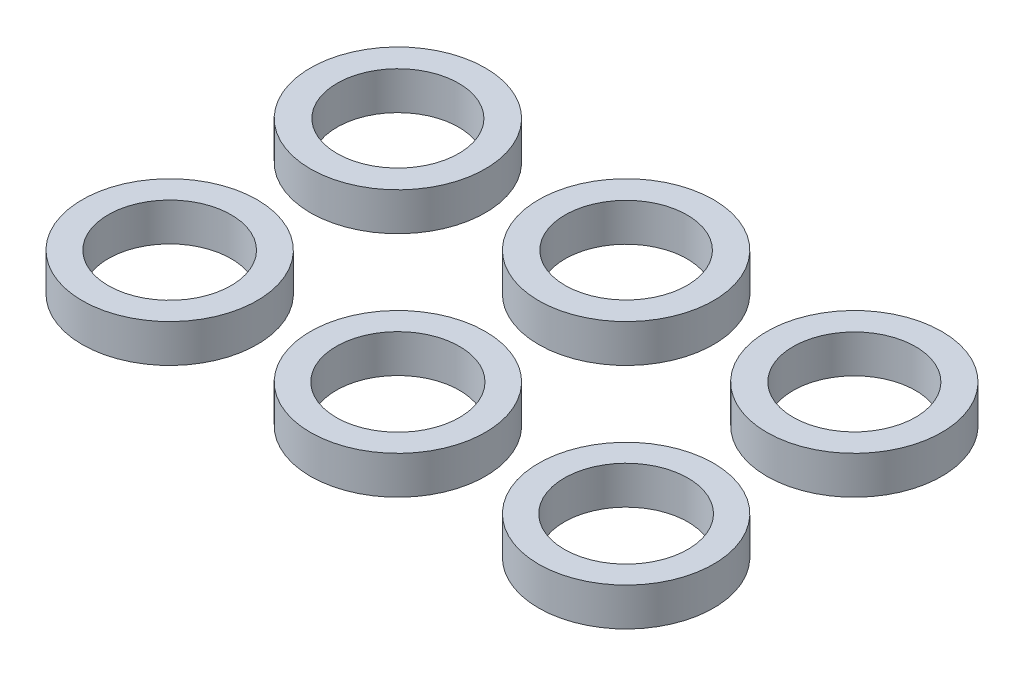
ISO-10303-21;
HEADER;
FILE_DESCRIPTION(('STEP AP214'),'2;1');
FILE_NAME('part.step','',(''),(''),'','','');
FILE_SCHEMA(('AUTOMOTIVE_DESIGN { 1 0 10303 214 1 1 1 1 }'));
ENDSEC;
DATA;
#1=APPLICATION_CONTEXT('core data for automotive mechanical design processes');
#2=APPLICATION_PROTOCOL_DEFINITION('international standard','automotive_design',2000,#1);
#3=PRODUCT_CONTEXT('',#1,'mechanical');
#4=PRODUCT('Part','Part','',(#3));
#5=PRODUCT_RELATED_PRODUCT_CATEGORY('part','',(#4));
#6=PRODUCT_DEFINITION_FORMATION('','',#4);
#7=PRODUCT_DEFINITION_CONTEXT('part definition',#1,'design');
#8=PRODUCT_DEFINITION('design','',#6,#7);
#9=PRODUCT_DEFINITION_SHAPE('','',#8);
#10=(LENGTH_UNIT() NAMED_UNIT(*) SI_UNIT(.MILLI.,.METRE.));
#11=(NAMED_UNIT(*) PLANE_ANGLE_UNIT() SI_UNIT($,.RADIAN.));
#12=(NAMED_UNIT(*) SI_UNIT($,.STERADIAN.) SOLID_ANGLE_UNIT());
#13=UNCERTAINTY_MEASURE_WITH_UNIT(LENGTH_MEASURE(1.E-05),#10,'distance_accuracy_value','');
#14=(GEOMETRIC_REPRESENTATION_CONTEXT(3) GLOBAL_UNCERTAINTY_ASSIGNED_CONTEXT((#13)) GLOBAL_UNIT_ASSIGNED_CONTEXT((#10,
#11,#12)) REPRESENTATION_CONTEXT('',''));
#15=CARTESIAN_POINT('',(0.,0.,0.));
#16=DIRECTION('',(0.,0.,1.));
#17=DIRECTION('',(1.,0.,0.));
#18=AXIS2_PLACEMENT_3D('',#15,#16,#17);
#19=CARTESIAN_POINT('',(3.12396350297161E-13,5.,30.));
#20=DIRECTION('',(0.,1.,0.));
#21=DIRECTION('',(0.,0.,1.));
#22=AXIS2_PLACEMENT_3D('',#19,#20,#21);
#23=PLANE('',#22);
#24=CARTESIAN_POINT('',(3.12396350297161E-13,5.,30.));
#25=DIRECTION('',(0.,1.,0.));
#26=DIRECTION('',(0.,0.,1.));
#27=AXIS2_PLACEMENT_3D('',#24,#25,#26);
#28=CIRCLE('',#27,11.5);
#29=CARTESIAN_POINT('',(3.12396350297161E-13,5.,41.5));
#30=VERTEX_POINT('',#29);
#31=EDGE_CURVE('E59',#30,#30,#28,.T.);
#32=ORIENTED_EDGE('',*,*,#31,.T.);
#33=EDGE_LOOP('',(#32));
#34=FACE_BOUND('',#33,.T.);
#35=CARTESIAN_POINT('',(3.12396350297161E-13,5.,30.));
#36=DIRECTION('',(0.,1.,0.));
#37=DIRECTION('',(0.,0.,1.));
#38=AXIS2_PLACEMENT_3D('',#35,#36,#37);
#39=CIRCLE('',#38,8.075);
#40=CARTESIAN_POINT('',(3.12396350297161E-13,5.,38.075));
#41=VERTEX_POINT('',#40);
#42=EDGE_CURVE('E50',#41,#41,#39,.T.);
#43=ORIENTED_EDGE('',*,*,#42,.F.);
#44=EDGE_LOOP('',(#43));
#45=FACE_BOUND('',#44,.T.);
#46=ADVANCED_FACE('F46',(#34,#45),#23,.T.);
#47=CARTESIAN_POINT('',(3.12396350297161E-13,0.,30.));
#48=DIRECTION('',(0.,1.,0.));
#49=DIRECTION('',(0.,0.,1.));
#50=AXIS2_PLACEMENT_3D('',#47,#48,#49);
#51=PLANE('',#50);
#52=CARTESIAN_POINT('',(3.12396350297161E-13,0.,30.));
#53=DIRECTION('',(0.,1.,0.));
#54=DIRECTION('',(0.,0.,1.));
#55=AXIS2_PLACEMENT_3D('',#52,#53,#54);
#56=CIRCLE('',#55,11.5);
#57=CARTESIAN_POINT('',(3.12396350297161E-13,0.,41.5));
#58=VERTEX_POINT('',#57);
#59=EDGE_CURVE('E57',#58,#58,#56,.T.);
#60=ORIENTED_EDGE('',*,*,#59,.F.);
#61=EDGE_LOOP('',(#60));
#62=FACE_BOUND('',#61,.T.);
#63=CARTESIAN_POINT('',(3.12396350297161E-13,0.,30.));
#64=DIRECTION('',(0.,1.,0.));
#65=DIRECTION('',(0.,0.,1.));
#66=AXIS2_PLACEMENT_3D('',#63,#64,#65);
#67=CIRCLE('',#66,8.075);
#68=CARTESIAN_POINT('',(3.12396350297161E-13,0.,38.075));
#69=VERTEX_POINT('',#68);
#70=EDGE_CURVE('E11',#69,#69,#67,.T.);
#71=ORIENTED_EDGE('',*,*,#70,.T.);
#72=EDGE_LOOP('',(#71));
#73=FACE_BOUND('',#72,.T.);
#74=ADVANCED_FACE('F67',(#62,#73),#51,.F.);
#75=CARTESIAN_POINT('',(3.12396350297161E-13,5.,30.));
#76=DIRECTION('',(0.,-1.,0.));
#77=DIRECTION('',(0.,0.,-1.));
#78=AXIS2_PLACEMENT_3D('',#75,#76,#77);
#79=CYLINDRICAL_SURFACE('',#78,11.5);
#80=ORIENTED_EDGE('',*,*,#31,.F.);
#81=EDGE_LOOP('',(#80));
#82=FACE_BOUND('',#81,.T.);
#83=ORIENTED_EDGE('',*,*,#59,.T.);
#84=EDGE_LOOP('',(#83));
#85=FACE_BOUND('',#84,.T.);
#86=ADVANCED_FACE('F65',(#82,#85),#79,.T.);
#87=CARTESIAN_POINT('',(3.12396350297161E-13,5.,30.));
#88=DIRECTION('',(0.,-1.,0.));
#89=DIRECTION('',(0.,0.,-1.));
#90=AXIS2_PLACEMENT_3D('',#87,#88,#89);
#91=CYLINDRICAL_SURFACE('',#90,8.075);
#92=ORIENTED_EDGE('',*,*,#42,.T.);
#93=EDGE_LOOP('',(#92));
#94=FACE_BOUND('',#93,.T.);
#95=ORIENTED_EDGE('',*,*,#70,.F.);
#96=EDGE_LOOP('',(#95));
#97=FACE_BOUND('',#96,.T.);
#98=ADVANCED_FACE('F48',(#94,#97),#91,.F.);
#99=CLOSED_SHELL('',(#46,#74,#86,#98));
#100=MANIFOLD_SOLID_BREP('B2',#99);
#101=CARTESIAN_POINT('',(60.0000000000003,5.,30.));
#102=DIRECTION('',(0.,1.,0.));
#103=DIRECTION('',(0.,0.,1.));
#104=AXIS2_PLACEMENT_3D('',#101,#102,#103);
#105=PLANE('',#104);
#106=CARTESIAN_POINT('',(60.0000000000003,5.,30.));
#107=DIRECTION('',(0.,1.,0.));
#108=DIRECTION('',(0.,0.,1.));
#109=AXIS2_PLACEMENT_3D('',#106,#107,#108);
#110=CIRCLE('',#109,11.5);
#111=CARTESIAN_POINT('',(60.0000000000003,5.,41.5));
#112=VERTEX_POINT('',#111);
#113=EDGE_CURVE('E129',#112,#112,#110,.T.);
#114=ORIENTED_EDGE('',*,*,#113,.T.);
#115=EDGE_LOOP('',(#114));
#116=FACE_BOUND('',#115,.T.);
#117=CARTESIAN_POINT('',(60.0000000000003,5.,30.));
#118=DIRECTION('',(0.,1.,0.));
#119=DIRECTION('',(0.,0.,1.));
#120=AXIS2_PLACEMENT_3D('',#117,#118,#119);
#121=CIRCLE('',#120,8.125);
#122=CARTESIAN_POINT('',(60.0000000000003,5.,38.125));
#123=VERTEX_POINT('',#122);
#124=EDGE_CURVE('E120',#123,#123,#121,.T.);
#125=ORIENTED_EDGE('',*,*,#124,.F.);
#126=EDGE_LOOP('',(#125));
#127=FACE_BOUND('',#126,.T.);
#128=ADVANCED_FACE('F116',(#116,#127),#105,.T.);
#129=CARTESIAN_POINT('',(60.0000000000003,0.,30.));
#130=DIRECTION('',(0.,1.,0.));
#131=DIRECTION('',(0.,0.,1.));
#132=AXIS2_PLACEMENT_3D('',#129,#130,#131);
#133=PLANE('',#132);
#134=CARTESIAN_POINT('',(60.0000000000003,0.,30.));
#135=DIRECTION('',(0.,1.,0.));
#136=DIRECTION('',(0.,0.,1.));
#137=AXIS2_PLACEMENT_3D('',#134,#135,#136);
#138=CIRCLE('',#137,11.5);
#139=CARTESIAN_POINT('',(60.0000000000003,0.,41.5));
#140=VERTEX_POINT('',#139);
#141=EDGE_CURVE('E127',#140,#140,#138,.T.);
#142=ORIENTED_EDGE('',*,*,#141,.F.);
#143=EDGE_LOOP('',(#142));
#144=FACE_BOUND('',#143,.T.);
#145=CARTESIAN_POINT('',(60.0000000000003,0.,30.));
#146=DIRECTION('',(0.,1.,0.));
#147=DIRECTION('',(0.,0.,1.));
#148=AXIS2_PLACEMENT_3D('',#145,#146,#147);
#149=CIRCLE('',#148,8.125);
#150=CARTESIAN_POINT('',(60.0000000000003,0.,38.125));
#151=VERTEX_POINT('',#150);
#152=EDGE_CURVE('E45',#151,#151,#149,.T.);
#153=ORIENTED_EDGE('',*,*,#152,.T.);
#154=EDGE_LOOP('',(#153));
#155=FACE_BOUND('',#154,.T.);
#156=ADVANCED_FACE('F137',(#144,#155),#133,.F.);
#157=CARTESIAN_POINT('',(60.0000000000003,5.,30.));
#158=DIRECTION('',(0.,-1.,0.));
#159=DIRECTION('',(0.,0.,-1.));
#160=AXIS2_PLACEMENT_3D('',#157,#158,#159);
#161=CYLINDRICAL_SURFACE('',#160,11.5);
#162=ORIENTED_EDGE('',*,*,#113,.F.);
#163=EDGE_LOOP('',(#162));
#164=FACE_BOUND('',#163,.T.);
#165=ORIENTED_EDGE('',*,*,#141,.T.);
#166=EDGE_LOOP('',(#165));
#167=FACE_BOUND('',#166,.T.);
#168=ADVANCED_FACE('F135',(#164,#167),#161,.T.);
#169=CARTESIAN_POINT('',(60.0000000000003,5.,30.));
#170=DIRECTION('',(0.,-1.,0.));
#171=DIRECTION('',(0.,0.,-1.));
#172=AXIS2_PLACEMENT_3D('',#169,#170,#171);
#173=CYLINDRICAL_SURFACE('',#172,8.125);
#174=ORIENTED_EDGE('',*,*,#124,.T.);
#175=EDGE_LOOP('',(#174));
#176=FACE_BOUND('',#175,.T.);
#177=ORIENTED_EDGE('',*,*,#152,.F.);
#178=EDGE_LOOP('',(#177));
#179=FACE_BOUND('',#178,.T.);
#180=ADVANCED_FACE('F118',(#176,#179),#173,.F.);
#181=CLOSED_SHELL('',(#128,#156,#168,#180));
#182=MANIFOLD_SOLID_BREP('B6',#181);
#183=CARTESIAN_POINT('',(30.0000000000003,5.,30.));
#184=DIRECTION('',(0.,1.,0.));
#185=DIRECTION('',(0.,0.,1.));
#186=AXIS2_PLACEMENT_3D('',#183,#184,#185);
#187=PLANE('',#186);
#188=CARTESIAN_POINT('',(30.0000000000003,5.,30.));
#189=DIRECTION('',(0.,1.,0.));
#190=DIRECTION('',(0.,0.,1.));
#191=AXIS2_PLACEMENT_3D('',#188,#189,#190);
#192=CIRCLE('',#191,11.5);
#193=CARTESIAN_POINT('',(30.0000000000003,5.,41.5));
#194=VERTEX_POINT('',#193);
#195=EDGE_CURVE('E199',#194,#194,#192,.T.);
#196=ORIENTED_EDGE('',*,*,#195,.T.);
#197=EDGE_LOOP('',(#196));
#198=FACE_BOUND('',#197,.T.);
#199=CARTESIAN_POINT('',(30.0000000000003,5.,30.));
#200=DIRECTION('',(0.,1.,0.));
#201=DIRECTION('',(0.,0.,1.));
#202=AXIS2_PLACEMENT_3D('',#199,#200,#201);
#203=CIRCLE('',#202,8.1);
#204=CARTESIAN_POINT('',(30.0000000000003,5.,38.1));
#205=VERTEX_POINT('',#204);
#206=EDGE_CURVE('E190',#205,#205,#203,.T.);
#207=ORIENTED_EDGE('',*,*,#206,.F.);
#208=EDGE_LOOP('',(#207));
#209=FACE_BOUND('',#208,.T.);
#210=ADVANCED_FACE('F186',(#198,#209),#187,.T.);
#211=CARTESIAN_POINT('',(30.0000000000003,0.,30.));
#212=DIRECTION('',(0.,1.,0.));
#213=DIRECTION('',(0.,0.,1.));
#214=AXIS2_PLACEMENT_3D('',#211,#212,#213);
#215=PLANE('',#214);
#216=CARTESIAN_POINT('',(30.0000000000003,0.,30.));
#217=DIRECTION('',(0.,1.,0.));
#218=DIRECTION('',(0.,0.,1.));
#219=AXIS2_PLACEMENT_3D('',#216,#217,#218);
#220=CIRCLE('',#219,11.5);
#221=CARTESIAN_POINT('',(30.0000000000003,0.,41.5));
#222=VERTEX_POINT('',#221);
#223=EDGE_CURVE('E197',#222,#222,#220,.T.);
#224=ORIENTED_EDGE('',*,*,#223,.F.);
#225=EDGE_LOOP('',(#224));
#226=FACE_BOUND('',#225,.T.);
#227=CARTESIAN_POINT('',(30.0000000000003,0.,30.));
#228=DIRECTION('',(0.,1.,0.));
#229=DIRECTION('',(0.,0.,1.));
#230=AXIS2_PLACEMENT_3D('',#227,#228,#229);
#231=CIRCLE('',#230,8.1);
#232=CARTESIAN_POINT('',(30.0000000000003,0.,38.1));
#233=VERTEX_POINT('',#232);
#234=EDGE_CURVE('E115',#233,#233,#231,.T.);
#235=ORIENTED_EDGE('',*,*,#234,.T.);
#236=EDGE_LOOP('',(#235));
#237=FACE_BOUND('',#236,.T.);
#238=ADVANCED_FACE('F207',(#226,#237),#215,.F.);
#239=CARTESIAN_POINT('',(30.0000000000003,5.,30.));
#240=DIRECTION('',(0.,-1.,0.));
#241=DIRECTION('',(0.,0.,-1.));
#242=AXIS2_PLACEMENT_3D('',#239,#240,#241);
#243=CYLINDRICAL_SURFACE('',#242,11.5);
#244=ORIENTED_EDGE('',*,*,#195,.F.);
#245=EDGE_LOOP('',(#244));
#246=FACE_BOUND('',#245,.T.);
#247=ORIENTED_EDGE('',*,*,#223,.T.);
#248=EDGE_LOOP('',(#247));
#249=FACE_BOUND('',#248,.T.);
#250=ADVANCED_FACE('F205',(#246,#249),#243,.T.);
#251=CARTESIAN_POINT('',(30.0000000000003,5.,30.));
#252=DIRECTION('',(0.,-1.,0.));
#253=DIRECTION('',(0.,0.,-1.));
#254=AXIS2_PLACEMENT_3D('',#251,#252,#253);
#255=CYLINDRICAL_SURFACE('',#254,8.1);
#256=ORIENTED_EDGE('',*,*,#206,.T.);
#257=EDGE_LOOP('',(#256));
#258=FACE_BOUND('',#257,.T.);
#259=ORIENTED_EDGE('',*,*,#234,.F.);
#260=EDGE_LOOP('',(#259));
#261=FACE_BOUND('',#260,.T.);
#262=ADVANCED_FACE('F188',(#258,#261),#255,.F.);
#263=CLOSED_SHELL('',(#210,#238,#250,#262));
#264=MANIFOLD_SOLID_BREP('B40',#263);
#265=CARTESIAN_POINT('',(60.,5.,0.));
#266=DIRECTION('',(0.,1.,0.));
#267=DIRECTION('',(0.,0.,1.));
#268=AXIS2_PLACEMENT_3D('',#265,#266,#267);
#269=PLANE('',#268);
#270=CARTESIAN_POINT('',(60.,5.,0.));
#271=DIRECTION('',(0.,1.,0.));
#272=DIRECTION('',(0.,0.,1.));
#273=AXIS2_PLACEMENT_3D('',#270,#271,#272);
#274=CIRCLE('',#273,11.5);
#275=CARTESIAN_POINT('',(60.,5.,11.5));
#276=VERTEX_POINT('',#275);
#277=EDGE_CURVE('E269',#276,#276,#274,.T.);
#278=ORIENTED_EDGE('',*,*,#277,.T.);
#279=EDGE_LOOP('',(#278));
#280=FACE_BOUND('',#279,.T.);
#281=CARTESIAN_POINT('',(60.,5.,0.));
#282=DIRECTION('',(0.,1.,0.));
#283=DIRECTION('',(0.,0.,1.));
#284=AXIS2_PLACEMENT_3D('',#281,#282,#283);
#285=CIRCLE('',#284,8.05000000000001);
#286=CARTESIAN_POINT('',(60.,5.,8.05000000000001));
#287=VERTEX_POINT('',#286);
#288=EDGE_CURVE('E260',#287,#287,#285,.T.);
#289=ORIENTED_EDGE('',*,*,#288,.F.);
#290=EDGE_LOOP('',(#289));
#291=FACE_BOUND('',#290,.T.);
#292=ADVANCED_FACE('F256',(#280,#291),#269,.T.);
#293=CARTESIAN_POINT('',(60.,0.,0.));
#294=DIRECTION('',(0.,1.,0.));
#295=DIRECTION('',(0.,0.,1.));
#296=AXIS2_PLACEMENT_3D('',#293,#294,#295);
#297=PLANE('',#296);
#298=CARTESIAN_POINT('',(60.,0.,0.));
#299=DIRECTION('',(0.,1.,0.));
#300=DIRECTION('',(0.,0.,1.));
#301=AXIS2_PLACEMENT_3D('',#298,#299,#300);
#302=CIRCLE('',#301,11.5);
#303=CARTESIAN_POINT('',(60.,0.,11.5));
#304=VERTEX_POINT('',#303);
#305=EDGE_CURVE('E267',#304,#304,#302,.T.);
#306=ORIENTED_EDGE('',*,*,#305,.F.);
#307=EDGE_LOOP('',(#306));
#308=FACE_BOUND('',#307,.T.);
#309=CARTESIAN_POINT('',(60.,0.,0.));
#310=DIRECTION('',(0.,1.,0.));
#311=DIRECTION('',(0.,0.,1.));
#312=AXIS2_PLACEMENT_3D('',#309,#310,#311);
#313=CIRCLE('',#312,8.05000000000001);
#314=CARTESIAN_POINT('',(60.,0.,8.05000000000001));
#315=VERTEX_POINT('',#314);
#316=EDGE_CURVE('E185',#315,#315,#313,.T.);
#317=ORIENTED_EDGE('',*,*,#316,.T.);
#318=EDGE_LOOP('',(#317));
#319=FACE_BOUND('',#318,.T.);
#320=ADVANCED_FACE('F277',(#308,#319),#297,.F.);
#321=CARTESIAN_POINT('',(60.,5.,0.));
#322=DIRECTION('',(0.,-1.,0.));
#323=DIRECTION('',(0.,0.,-1.));
#324=AXIS2_PLACEMENT_3D('',#321,#322,#323);
#325=CYLINDRICAL_SURFACE('',#324,11.5);
#326=ORIENTED_EDGE('',*,*,#277,.F.);
#327=EDGE_LOOP('',(#326));
#328=FACE_BOUND('',#327,.T.);
#329=ORIENTED_EDGE('',*,*,#305,.T.);
#330=EDGE_LOOP('',(#329));
#331=FACE_BOUND('',#330,.T.);
#332=ADVANCED_FACE('F275',(#328,#331),#325,.T.);
#333=CARTESIAN_POINT('',(60.,5.,0.));
#334=DIRECTION('',(0.,-1.,0.));
#335=DIRECTION('',(0.,0.,-1.));
#336=AXIS2_PLACEMENT_3D('',#333,#334,#335);
#337=CYLINDRICAL_SURFACE('',#336,8.05000000000001);
#338=ORIENTED_EDGE('',*,*,#288,.T.);
#339=EDGE_LOOP('',(#338));
#340=FACE_BOUND('',#339,.T.);
#341=ORIENTED_EDGE('',*,*,#316,.F.);
#342=EDGE_LOOP('',(#341));
#343=FACE_BOUND('',#342,.T.);
#344=ADVANCED_FACE('F258',(#340,#343),#337,.F.);
#345=CLOSED_SHELL('',(#292,#320,#332,#344));
#346=MANIFOLD_SOLID_BREP('B110',#345);
#347=CARTESIAN_POINT('',(30.,5.,0.));
#348=DIRECTION('',(0.,1.,0.));
#349=DIRECTION('',(0.,0.,1.));
#350=AXIS2_PLACEMENT_3D('',#347,#348,#349);
#351=PLANE('',#350);
#352=CARTESIAN_POINT('',(30.,5.,0.));
#353=DIRECTION('',(0.,1.,0.));
#354=DIRECTION('',(0.,0.,1.));
#355=AXIS2_PLACEMENT_3D('',#352,#353,#354);
#356=CIRCLE('',#355,11.5);
#357=CARTESIAN_POINT('',(30.,5.,11.5));
#358=VERTEX_POINT('',#357);
#359=EDGE_CURVE('E338',#358,#358,#356,.T.);
#360=ORIENTED_EDGE('',*,*,#359,.T.);
#361=EDGE_LOOP('',(#360));
#362=FACE_BOUND('',#361,.T.);
#363=CARTESIAN_POINT('',(30.,5.,0.));
#364=DIRECTION('',(0.,1.,0.));
#365=DIRECTION('',(0.,0.,1.));
#366=AXIS2_PLACEMENT_3D('',#363,#364,#365);
#367=CIRCLE('',#366,8.025);
#368=CARTESIAN_POINT('',(30.,5.,8.025));
#369=VERTEX_POINT('',#368);
#370=EDGE_CURVE('E329',#369,#369,#367,.T.);
#371=ORIENTED_EDGE('',*,*,#370,.F.);
#372=EDGE_LOOP('',(#371));
#373=FACE_BOUND('',#372,.T.);
#374=ADVANCED_FACE('F325',(#362,#373),#351,.T.);
#375=CARTESIAN_POINT('',(30.,0.,0.));
#376=DIRECTION('',(0.,1.,0.));
#377=DIRECTION('',(0.,0.,1.));
#378=AXIS2_PLACEMENT_3D('',#375,#376,#377);
#379=PLANE('',#378);
#380=CARTESIAN_POINT('',(30.,0.,0.));
#381=DIRECTION('',(0.,1.,0.));
#382=DIRECTION('',(0.,0.,1.));
#383=AXIS2_PLACEMENT_3D('',#380,#381,#382);
#384=CIRCLE('',#383,11.5);
#385=CARTESIAN_POINT('',(30.,0.,11.5));
#386=VERTEX_POINT('',#385);
#387=EDGE_CURVE('E336',#386,#386,#384,.T.);
#388=ORIENTED_EDGE('',*,*,#387,.F.);
#389=EDGE_LOOP('',(#388));
#390=FACE_BOUND('',#389,.T.);
#391=CARTESIAN_POINT('',(30.,0.,0.));
#392=DIRECTION('',(0.,1.,0.));
#393=DIRECTION('',(0.,0.,1.));
#394=AXIS2_PLACEMENT_3D('',#391,#392,#393);
#395=CIRCLE('',#394,8.025);
#396=CARTESIAN_POINT('',(30.,0.,8.025));
#397=VERTEX_POINT('',#396);
#398=EDGE_CURVE('E255',#397,#397,#395,.T.);
#399=ORIENTED_EDGE('',*,*,#398,.T.);
#400=EDGE_LOOP('',(#399));
#401=FACE_BOUND('',#400,.T.);
#402=ADVANCED_FACE('F346',(#390,#401),#379,.F.);
#403=CARTESIAN_POINT('',(30.,5.,0.));
#404=DIRECTION('',(0.,-1.,0.));
#405=DIRECTION('',(0.,0.,-1.));
#406=AXIS2_PLACEMENT_3D('',#403,#404,#405);
#407=CYLINDRICAL_SURFACE('',#406,11.5);
#408=ORIENTED_EDGE('',*,*,#359,.F.);
#409=EDGE_LOOP('',(#408));
#410=FACE_BOUND('',#409,.T.);
#411=ORIENTED_EDGE('',*,*,#387,.T.);
#412=EDGE_LOOP('',(#411));
#413=FACE_BOUND('',#412,.T.);
#414=ADVANCED_FACE('F344',(#410,#413),#407,.T.);
#415=CARTESIAN_POINT('',(30.,5.,0.));
#416=DIRECTION('',(0.,-1.,0.));
#417=DIRECTION('',(0.,0.,-1.));
#418=AXIS2_PLACEMENT_3D('',#415,#416,#417);
#419=CYLINDRICAL_SURFACE('',#418,8.025);
#420=ORIENTED_EDGE('',*,*,#370,.T.);
#421=EDGE_LOOP('',(#420));
#422=FACE_BOUND('',#421,.T.);
#423=ORIENTED_EDGE('',*,*,#398,.F.);
#424=EDGE_LOOP('',(#423));
#425=FACE_BOUND('',#424,.T.);
#426=ADVANCED_FACE('F327',(#422,#425),#419,.F.);
#427=CLOSED_SHELL('',(#374,#402,#414,#426));
#428=MANIFOLD_SOLID_BREP('B180',#427);
#429=CARTESIAN_POINT('',(0.,5.,0.));
#430=DIRECTION('',(0.,1.,0.));
#431=DIRECTION('',(0.,0.,1.));
#432=AXIS2_PLACEMENT_3D('',#429,#430,#431);
#433=PLANE('',#432);
#434=CARTESIAN_POINT('',(0.,5.,0.));
#435=DIRECTION('',(0.,1.,0.));
#436=DIRECTION('',(0.,0.,1.));
#437=AXIS2_PLACEMENT_3D('',#434,#435,#436);
#438=CIRCLE('',#437,11.5);
#439=CARTESIAN_POINT('',(0.,5.,11.5));
#440=VERTEX_POINT('',#439);
#441=EDGE_CURVE('E324',#440,#440,#438,.T.);
#442=ORIENTED_EDGE('',*,*,#441,.T.);
#443=EDGE_LOOP('',(#442));
#444=FACE_BOUND('',#443,.T.);
#445=CARTESIAN_POINT('',(0.,5.,0.));
#446=DIRECTION('',(0.,1.,0.));
#447=DIRECTION('',(0.,0.,1.));
#448=AXIS2_PLACEMENT_3D('',#445,#446,#447);
#449=CIRCLE('',#448,8.);
#450=CARTESIAN_POINT('',(0.,5.,8.));
#451=VERTEX_POINT('',#450);
#452=EDGE_CURVE('E398',#451,#451,#449,.T.);
#453=ORIENTED_EDGE('',*,*,#452,.F.);
#454=EDGE_LOOP('',(#453));
#455=FACE_BOUND('',#454,.T.);
#456=ADVANCED_FACE('F387',(#444,#455),#433,.T.);
#457=CARTESIAN_POINT('',(0.,0.,0.));
#458=DIRECTION('',(0.,1.,0.));
#459=DIRECTION('',(0.,0.,1.));
#460=AXIS2_PLACEMENT_3D('',#457,#458,#459);
#461=PLANE('',#460);
#462=CARTESIAN_POINT('',(0.,0.,0.));
#463=DIRECTION('',(0.,1.,0.));
#464=DIRECTION('',(0.,0.,1.));
#465=AXIS2_PLACEMENT_3D('',#462,#463,#464);
#466=CIRCLE('',#465,11.5);
#467=CARTESIAN_POINT('',(0.,0.,11.5));
#468=VERTEX_POINT('',#467);
#469=EDGE_CURVE('E391',#468,#468,#466,.T.);
#470=ORIENTED_EDGE('',*,*,#469,.F.);
#471=EDGE_LOOP('',(#470));
#472=FACE_BOUND('',#471,.T.);
#473=CARTESIAN_POINT('',(0.,0.,0.));
#474=DIRECTION('',(0.,1.,0.));
#475=DIRECTION('',(0.,0.,1.));
#476=AXIS2_PLACEMENT_3D('',#473,#474,#475);
#477=CIRCLE('',#476,8.);
#478=CARTESIAN_POINT('',(0.,0.,8.));
#479=VERTEX_POINT('',#478);
#480=EDGE_CURVE('E400',#479,#479,#477,.T.);
#481=ORIENTED_EDGE('',*,*,#480,.T.);
#482=EDGE_LOOP('',(#481));
#483=FACE_BOUND('',#482,.T.);
#484=ADVANCED_FACE('F410',(#472,#483),#461,.F.);
#485=CARTESIAN_POINT('',(0.,5.,0.));
#486=DIRECTION('',(0.,-1.,0.));
#487=DIRECTION('',(0.,0.,-1.));
#488=AXIS2_PLACEMENT_3D('',#485,#486,#487);
#489=CYLINDRICAL_SURFACE('',#488,11.5);
#490=ORIENTED_EDGE('',*,*,#441,.F.);
#491=EDGE_LOOP('',(#490));
#492=FACE_BOUND('',#491,.T.);
#493=ORIENTED_EDGE('',*,*,#469,.T.);
#494=EDGE_LOOP('',(#493));
#495=FACE_BOUND('',#494,.T.);
#496=ADVANCED_FACE('F389',(#492,#495),#489,.T.);
#497=CARTESIAN_POINT('',(0.,5.,0.));
#498=DIRECTION('',(0.,-1.,0.));
#499=DIRECTION('',(0.,0.,-1.));
#500=AXIS2_PLACEMENT_3D('',#497,#498,#499);
#501=CYLINDRICAL_SURFACE('',#500,8.);
#502=ORIENTED_EDGE('',*,*,#452,.T.);
#503=EDGE_LOOP('',(#502));
#504=FACE_BOUND('',#503,.T.);
#505=ORIENTED_EDGE('',*,*,#480,.F.);
#506=EDGE_LOOP('',(#505));
#507=FACE_BOUND('',#506,.T.);
#508=ADVANCED_FACE('F406',(#504,#507),#501,.F.);
#509=CLOSED_SHELL('',(#456,#484,#496,#508));
#510=MANIFOLD_SOLID_BREP('B250',#509);
#511=ADVANCED_BREP_SHAPE_REPRESENTATION('',(#18,#100,#182,#264,#346,#428,#510),#14);
#512=SHAPE_DEFINITION_REPRESENTATION(#9,#511);
ENDSEC;
END-ISO-10303-21;
